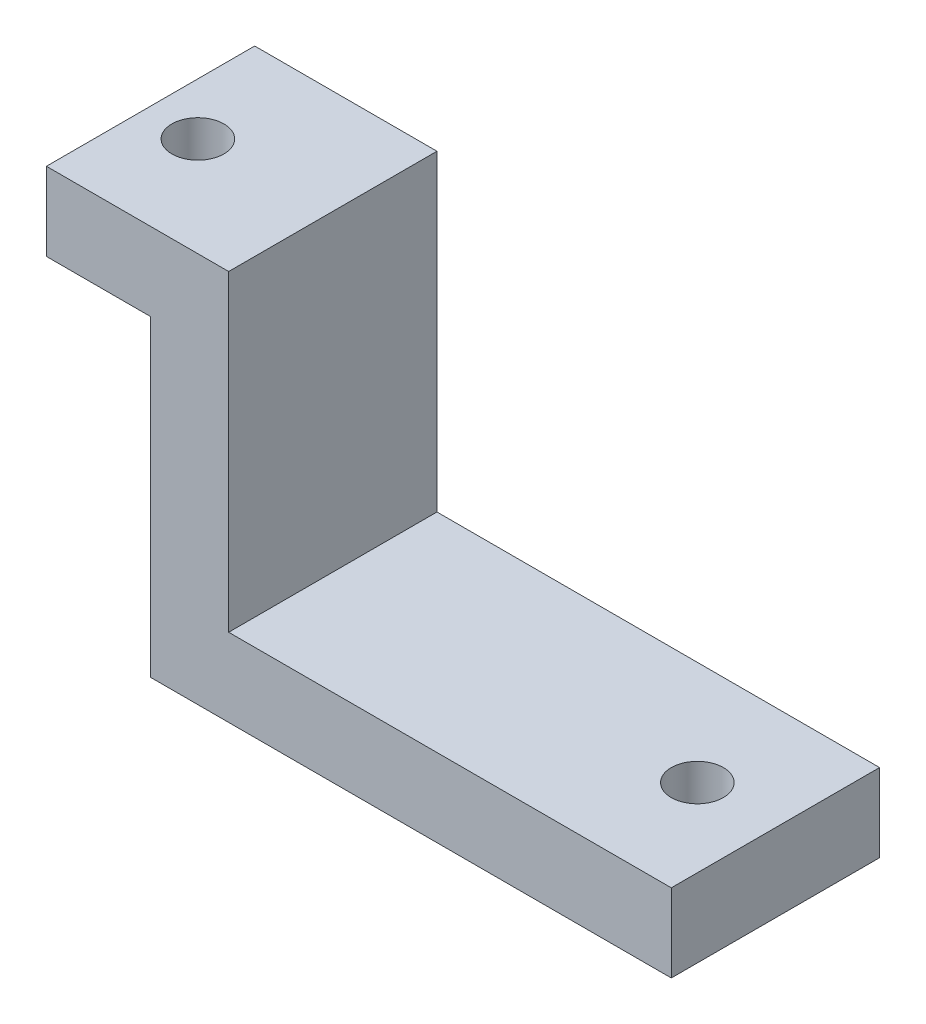
ISO-10303-21;
HEADER;
FILE_DESCRIPTION(('STEP AP214'),'2;1');
FILE_NAME('part.step','',(''),(''),'','','');
FILE_SCHEMA(('AUTOMOTIVE_DESIGN { 1 0 10303 214 1 1 1 1 }'));
ENDSEC;
DATA;
#1=APPLICATION_CONTEXT('core data for automotive mechanical design processes');
#2=APPLICATION_PROTOCOL_DEFINITION('international standard','automotive_design',2000,#1);
#3=PRODUCT_CONTEXT('',#1,'mechanical');
#4=PRODUCT('Part','Part','',(#3));
#5=PRODUCT_RELATED_PRODUCT_CATEGORY('part','',(#4));
#6=PRODUCT_DEFINITION_FORMATION('','',#4);
#7=PRODUCT_DEFINITION_CONTEXT('part definition',#1,'design');
#8=PRODUCT_DEFINITION('design','',#6,#7);
#9=PRODUCT_DEFINITION_SHAPE('','',#8);
#10=(LENGTH_UNIT() NAMED_UNIT(*) SI_UNIT(.MILLI.,.METRE.));
#11=(NAMED_UNIT(*) PLANE_ANGLE_UNIT() SI_UNIT($,.RADIAN.));
#12=(NAMED_UNIT(*) SI_UNIT($,.STERADIAN.) SOLID_ANGLE_UNIT());
#13=UNCERTAINTY_MEASURE_WITH_UNIT(LENGTH_MEASURE(1.E-05),#10,'distance_accuracy_value','');
#14=(GEOMETRIC_REPRESENTATION_CONTEXT(3) GLOBAL_UNCERTAINTY_ASSIGNED_CONTEXT((#13)) GLOBAL_UNIT_ASSIGNED_CONTEXT((#10,
#11,#12)) REPRESENTATION_CONTEXT('',''));
#15=CARTESIAN_POINT('',(0.,0.,0.));
#16=DIRECTION('',(0.,0.,1.));
#17=DIRECTION('',(1.,0.,0.));
#18=AXIS2_PLACEMENT_3D('',#15,#16,#17);
#19=CARTESIAN_POINT('',(0.,0.,0.));
#20=DIRECTION('',(-1.,0.,0.));
#21=DIRECTION('',(0.,0.,1.));
#22=AXIS2_PLACEMENT_3D('',#19,#20,#21);
#23=PLANE('',#22);
#24=DIRECTION('',(0.,-1.,0.));
#25=VECTOR('',#24,1.);
#26=CARTESIAN_POINT('',(0.,0.,0.));
#27=LINE('',#26,#25);
#28=CARTESIAN_POINT('',(0.,12.,0.));
#29=VERTEX_POINT('',#28);
#30=CARTESIAN_POINT('',(0.,0.,0.));
#31=VERTEX_POINT('',#30);
#32=EDGE_CURVE('E153',#29,#31,#27,.T.);
#33=ORIENTED_EDGE('',*,*,#32,.F.);
#34=DIRECTION('',(0.,0.,-1.));
#35=VECTOR('',#34,1.);
#36=CARTESIAN_POINT('',(0.,12.,-8.));
#37=LINE('',#36,#35);
#38=CARTESIAN_POINT('',(0.,12.,-8.));
#39=VERTEX_POINT('',#38);
#40=EDGE_CURVE('E121',#29,#39,#37,.T.);
#41=ORIENTED_EDGE('',*,*,#40,.T.);
#42=DIRECTION('',(0.,1.,0.));
#43=VECTOR('',#42,1.);
#44=CARTESIAN_POINT('',(0.,0.,-8.));
#45=LINE('',#44,#43);
#46=CARTESIAN_POINT('',(0.,0.,-8.));
#47=VERTEX_POINT('',#46);
#48=EDGE_CURVE('E120',#47,#39,#45,.T.);
#49=ORIENTED_EDGE('',*,*,#48,.F.);
#50=DIRECTION('',(0.,0.,-1.));
#51=VECTOR('',#50,1.);
#52=CARTESIAN_POINT('',(0.,0.,0.));
#53=LINE('',#52,#51);
#54=EDGE_CURVE('E162',#31,#47,#53,.T.);
#55=ORIENTED_EDGE('',*,*,#54,.F.);
#56=EDGE_LOOP('',(#33,#41,#49,#55));
#57=FACE_BOUND('',#56,.T.);
#58=ADVANCED_FACE('F34',(#57),#23,.T.);
#59=CARTESIAN_POINT('',(3.,0.,0.));
#60=DIRECTION('',(-1.,0.,0.));
#61=DIRECTION('',(0.,0.,1.));
#62=AXIS2_PLACEMENT_3D('',#59,#60,#61);
#63=PLANE('',#62);
#64=DIRECTION('',(0.,0.,1.));
#65=VECTOR('',#64,1.);
#66=CARTESIAN_POINT('',(3.,3.,-8.));
#67=LINE('',#66,#65);
#68=CARTESIAN_POINT('',(3.,3.,-8.));
#69=VERTEX_POINT('',#68);
#70=CARTESIAN_POINT('',(3.,3.,0.));
#71=VERTEX_POINT('',#70);
#72=EDGE_CURVE('E57',#69,#71,#67,.T.);
#73=ORIENTED_EDGE('',*,*,#72,.F.);
#74=DIRECTION('',(0.,1.,0.));
#75=VECTOR('',#74,1.);
#76=CARTESIAN_POINT('',(3.,0.,-8.));
#77=LINE('',#76,#75);
#78=CARTESIAN_POINT('',(3.,15.,-8.));
#79=VERTEX_POINT('',#78);
#80=EDGE_CURVE('E156',#69,#79,#77,.T.);
#81=ORIENTED_EDGE('',*,*,#80,.T.);
#82=DIRECTION('',(0.,0.,1.));
#83=VECTOR('',#82,1.);
#84=CARTESIAN_POINT('',(3.,15.,0.));
#85=LINE('',#84,#83);
#86=CARTESIAN_POINT('',(3.,15.,0.));
#87=VERTEX_POINT('',#86);
#88=EDGE_CURVE('E158',#79,#87,#85,.T.);
#89=ORIENTED_EDGE('',*,*,#88,.T.);
#90=DIRECTION('',(0.,-1.,0.));
#91=VECTOR('',#90,1.);
#92=CARTESIAN_POINT('',(3.,0.,0.));
#93=LINE('',#92,#91);
#94=EDGE_CURVE('E154',#87,#71,#93,.T.);
#95=ORIENTED_EDGE('',*,*,#94,.T.);
#96=EDGE_LOOP('',(#73,#81,#89,#95));
#97=FACE_BOUND('',#96,.T.);
#98=ADVANCED_FACE('F191',(#97),#63,.F.);
#99=CARTESIAN_POINT('',(3.,0.,0.));
#100=DIRECTION('',(0.,0.,-1.));
#101=DIRECTION('',(-1.,0.,0.));
#102=AXIS2_PLACEMENT_3D('',#99,#100,#101);
#103=PLANE('',#102);
#104=DIRECTION('',(-1.,0.,0.));
#105=VECTOR('',#104,1.);
#106=CARTESIAN_POINT('',(3.,15.,0.));
#107=LINE('',#106,#105);
#108=CARTESIAN_POINT('',(-4.,15.,0.));
#109=VERTEX_POINT('',#108);
#110=EDGE_CURVE('E160',#87,#109,#107,.T.);
#111=ORIENTED_EDGE('',*,*,#110,.T.);
#112=DIRECTION('',(0.,1.,0.));
#113=VECTOR('',#112,1.);
#114=CARTESIAN_POINT('',(-4.,12.,0.));
#115=LINE('',#114,#113);
#116=CARTESIAN_POINT('',(-4.,12.,0.));
#117=VERTEX_POINT('',#116);
#118=EDGE_CURVE('E110',#117,#109,#115,.T.);
#119=ORIENTED_EDGE('',*,*,#118,.F.);
#120=DIRECTION('',(1.,0.,0.));
#121=VECTOR('',#120,1.);
#122=CARTESIAN_POINT('',(0.,12.,0.));
#123=LINE('',#122,#121);
#124=EDGE_CURVE('E111',#117,#29,#123,.T.);
#125=ORIENTED_EDGE('',*,*,#124,.T.);
#126=ORIENTED_EDGE('',*,*,#32,.T.);
#127=DIRECTION('',(-1.,0.,0.));
#128=VECTOR('',#127,1.);
#129=CARTESIAN_POINT('',(3.,0.,0.));
#130=LINE('',#129,#128);
#131=CARTESIAN_POINT('',(20.,0.,0.));
#132=VERTEX_POINT('',#131);
#133=EDGE_CURVE('E11',#132,#31,#130,.T.);
#134=ORIENTED_EDGE('',*,*,#133,.F.);
#135=DIRECTION('',(0.,-1.,0.));
#136=VECTOR('',#135,1.);
#137=CARTESIAN_POINT('',(20.,3.,0.));
#138=LINE('',#137,#136);
#139=CARTESIAN_POINT('',(20.,3.,0.));
#140=VERTEX_POINT('',#139);
#141=EDGE_CURVE('E150',#140,#132,#138,.T.);
#142=ORIENTED_EDGE('',*,*,#141,.F.);
#143=DIRECTION('',(1.,0.,0.));
#144=VECTOR('',#143,1.);
#145=CARTESIAN_POINT('',(3.,3.,0.));
#146=LINE('',#145,#144);
#147=EDGE_CURVE('E138',#71,#140,#146,.T.);
#148=ORIENTED_EDGE('',*,*,#147,.F.);
#149=ORIENTED_EDGE('',*,*,#94,.F.);
#150=EDGE_LOOP('',(#111,#119,#125,#126,#134,#142,#148,#149));
#151=FACE_BOUND('',#150,.T.);
#152=ADVANCED_FACE('F36',(#151),#103,.F.);
#153=CARTESIAN_POINT('',(3.,0.,0.));
#154=DIRECTION('',(0.,1.,0.));
#155=DIRECTION('',(0.,0.,1.));
#156=AXIS2_PLACEMENT_3D('',#153,#154,#155);
#157=PLANE('',#156);
#158=ORIENTED_EDGE('',*,*,#54,.T.);
#159=DIRECTION('',(-1.,0.,0.));
#160=VECTOR('',#159,1.);
#161=CARTESIAN_POINT('',(3.,0.,-8.));
#162=LINE('',#161,#160);
#163=CARTESIAN_POINT('',(20.,0.,-8.));
#164=VERTEX_POINT('',#163);
#165=EDGE_CURVE('E42',#164,#47,#162,.T.);
#166=ORIENTED_EDGE('',*,*,#165,.F.);
#167=DIRECTION('',(0.,0.,-1.));
#168=VECTOR('',#167,1.);
#169=CARTESIAN_POINT('',(20.,0.,-8.));
#170=LINE('',#169,#168);
#171=EDGE_CURVE('E134',#132,#164,#170,.T.);
#172=ORIENTED_EDGE('',*,*,#171,.F.);
#173=ORIENTED_EDGE('',*,*,#133,.T.);
#174=EDGE_LOOP('',(#158,#166,#172,#173));
#175=FACE_BOUND('',#174,.T.);
#176=CARTESIAN_POINT('',(17.,0.,-4.));
#177=DIRECTION('',(0.,1.,0.));
#178=DIRECTION('',(0.,0.,1.));
#179=AXIS2_PLACEMENT_3D('',#176,#177,#178);
#180=CIRCLE('',#179,1.);
#181=CARTESIAN_POINT('',(17.,0.,-3.));
#182=VERTEX_POINT('',#181);
#183=EDGE_CURVE('E129',#182,#182,#180,.T.);
#184=ORIENTED_EDGE('',*,*,#183,.T.);
#185=EDGE_LOOP('',(#184));
#186=FACE_BOUND('',#185,.T.);
#187=ADVANCED_FACE('F189',(#175,#186),#157,.F.);
#188=CARTESIAN_POINT('',(3.,0.,-8.));
#189=DIRECTION('',(0.,0.,1.));
#190=DIRECTION('',(1.,0.,0.));
#191=AXIS2_PLACEMENT_3D('',#188,#189,#190);
#192=PLANE('',#191);
#193=ORIENTED_EDGE('',*,*,#48,.T.);
#194=DIRECTION('',(-1.,0.,0.));
#195=VECTOR('',#194,1.);
#196=CARTESIAN_POINT('',(0.,12.,-8.));
#197=LINE('',#196,#195);
#198=CARTESIAN_POINT('',(-4.,12.,-8.));
#199=VERTEX_POINT('',#198);
#200=EDGE_CURVE('E49',#39,#199,#197,.T.);
#201=ORIENTED_EDGE('',*,*,#200,.T.);
#202=DIRECTION('',(0.,1.,0.));
#203=VECTOR('',#202,1.);
#204=CARTESIAN_POINT('',(-4.,12.,-8.));
#205=LINE('',#204,#203);
#206=CARTESIAN_POINT('',(-4.,15.,-8.));
#207=VERTEX_POINT('',#206);
#208=EDGE_CURVE('E101',#199,#207,#205,.T.);
#209=ORIENTED_EDGE('',*,*,#208,.T.);
#210=DIRECTION('',(-1.,0.,0.));
#211=VECTOR('',#210,1.);
#212=CARTESIAN_POINT('',(3.,15.,-8.));
#213=LINE('',#212,#211);
#214=EDGE_CURVE('E166',#79,#207,#213,.T.);
#215=ORIENTED_EDGE('',*,*,#214,.F.);
#216=ORIENTED_EDGE('',*,*,#80,.F.);
#217=DIRECTION('',(-1.,0.,0.));
#218=VECTOR('',#217,1.);
#219=CARTESIAN_POINT('',(3.,3.,-8.));
#220=LINE('',#219,#218);
#221=CARTESIAN_POINT('',(20.,3.,-8.));
#222=VERTEX_POINT('',#221);
#223=EDGE_CURVE('E142',#222,#69,#220,.T.);
#224=ORIENTED_EDGE('',*,*,#223,.F.);
#225=DIRECTION('',(0.,-1.,0.));
#226=VECTOR('',#225,1.);
#227=CARTESIAN_POINT('',(20.,3.,-8.));
#228=LINE('',#227,#226);
#229=EDGE_CURVE('E145',#222,#164,#228,.T.);
#230=ORIENTED_EDGE('',*,*,#229,.T.);
#231=ORIENTED_EDGE('',*,*,#165,.T.);
#232=EDGE_LOOP('',(#193,#201,#209,#215,#216,#224,#230,#231));
#233=FACE_BOUND('',#232,.T.);
#234=ADVANCED_FACE('F117',(#233),#192,.F.);
#235=CARTESIAN_POINT('',(3.,15.,0.));
#236=DIRECTION('',(0.,-1.,0.));
#237=DIRECTION('',(0.,0.,-1.));
#238=AXIS2_PLACEMENT_3D('',#235,#236,#237);
#239=PLANE('',#238);
#240=ORIENTED_EDGE('',*,*,#214,.T.);
#241=DIRECTION('',(0.,0.,1.));
#242=VECTOR('',#241,1.);
#243=CARTESIAN_POINT('',(-4.,15.,-8.));
#244=LINE('',#243,#242);
#245=EDGE_CURVE('E107',#207,#109,#244,.T.);
#246=ORIENTED_EDGE('',*,*,#245,.T.);
#247=ORIENTED_EDGE('',*,*,#110,.F.);
#248=ORIENTED_EDGE('',*,*,#88,.F.);
#249=EDGE_LOOP('',(#240,#246,#247,#248));
#250=FACE_BOUND('',#249,.T.);
#251=CARTESIAN_POINT('',(-2.,15.,-3.81772143015269));
#252=DIRECTION('',(0.,1.,0.));
#253=DIRECTION('',(0.,0.,1.));
#254=AXIS2_PLACEMENT_3D('',#251,#252,#253);
#255=CIRCLE('',#254,1.);
#256=CARTESIAN_POINT('',(-2.,15.,-2.81772143015269));
#257=VERTEX_POINT('',#256);
#258=EDGE_CURVE('E314',#257,#257,#255,.T.);
#259=ORIENTED_EDGE('',*,*,#258,.F.);
#260=EDGE_LOOP('',(#259));
#261=FACE_BOUND('',#260,.T.);
#262=ADVANCED_FACE('F178',(#250,#261),#239,.F.);
#263=CARTESIAN_POINT('',(0.,3.,0.));
#264=DIRECTION('',(0.,1.,0.));
#265=DIRECTION('',(0.,0.,1.));
#266=AXIS2_PLACEMENT_3D('',#263,#264,#265);
#267=PLANE('',#266);
#268=ORIENTED_EDGE('',*,*,#72,.T.);
#269=ORIENTED_EDGE('',*,*,#147,.T.);
#270=DIRECTION('',(0.,0.,-1.));
#271=VECTOR('',#270,1.);
#272=CARTESIAN_POINT('',(20.,3.,-8.));
#273=LINE('',#272,#271);
#274=EDGE_CURVE('E140',#140,#222,#273,.T.);
#275=ORIENTED_EDGE('',*,*,#274,.T.);
#276=ORIENTED_EDGE('',*,*,#223,.T.);
#277=EDGE_LOOP('',(#268,#269,#275,#276));
#278=FACE_BOUND('',#277,.T.);
#279=CARTESIAN_POINT('',(17.,3.,-4.));
#280=DIRECTION('',(0.,1.,0.));
#281=DIRECTION('',(0.,0.,1.));
#282=AXIS2_PLACEMENT_3D('',#279,#280,#281);
#283=CIRCLE('',#282,1.);
#284=CARTESIAN_POINT('',(17.,3.,-3.));
#285=VERTEX_POINT('',#284);
#286=EDGE_CURVE('E131',#285,#285,#283,.T.);
#287=ORIENTED_EDGE('',*,*,#286,.F.);
#288=EDGE_LOOP('',(#287));
#289=FACE_BOUND('',#288,.T.);
#290=ADVANCED_FACE('F182',(#278,#289),#267,.T.);
#291=CARTESIAN_POINT('',(20.,3.,-8.));
#292=DIRECTION('',(-1.,0.,0.));
#293=DIRECTION('',(0.,0.,1.));
#294=AXIS2_PLACEMENT_3D('',#291,#292,#293);
#295=PLANE('',#294);
#296=ORIENTED_EDGE('',*,*,#171,.T.);
#297=ORIENTED_EDGE('',*,*,#229,.F.);
#298=ORIENTED_EDGE('',*,*,#274,.F.);
#299=ORIENTED_EDGE('',*,*,#141,.T.);
#300=EDGE_LOOP('',(#296,#297,#298,#299));
#301=FACE_BOUND('',#300,.T.);
#302=ADVANCED_FACE('F188',(#301),#295,.F.);
#303=CARTESIAN_POINT('',(17.,3.,-4.));
#304=DIRECTION('',(0.,-1.,0.));
#305=DIRECTION('',(0.,0.,-1.));
#306=AXIS2_PLACEMENT_3D('',#303,#304,#305);
#307=CYLINDRICAL_SURFACE('',#306,1.);
#308=ORIENTED_EDGE('',*,*,#286,.T.);
#309=EDGE_LOOP('',(#308));
#310=FACE_BOUND('',#309,.T.);
#311=ORIENTED_EDGE('',*,*,#183,.F.);
#312=EDGE_LOOP('',(#311));
#313=FACE_BOUND('',#312,.T.);
#314=ADVANCED_FACE('F230',(#310,#313),#307,.F.);
#315=CARTESIAN_POINT('',(-4.,12.,-8.));
#316=DIRECTION('',(-1.,0.,0.));
#317=DIRECTION('',(0.,0.,1.));
#318=AXIS2_PLACEMENT_3D('',#315,#316,#317);
#319=PLANE('',#318);
#320=ORIENTED_EDGE('',*,*,#245,.F.);
#321=ORIENTED_EDGE('',*,*,#208,.F.);
#322=DIRECTION('',(0.,0.,1.));
#323=VECTOR('',#322,1.);
#324=CARTESIAN_POINT('',(-4.,12.,-8.));
#325=LINE('',#324,#323);
#326=EDGE_CURVE('E104',#199,#117,#325,.T.);
#327=ORIENTED_EDGE('',*,*,#326,.T.);
#328=ORIENTED_EDGE('',*,*,#118,.T.);
#329=EDGE_LOOP('',(#320,#321,#327,#328));
#330=FACE_BOUND('',#329,.T.);
#331=ADVANCED_FACE('F102',(#330),#319,.T.);
#332=CARTESIAN_POINT('',(0.,12.,0.));
#333=DIRECTION('',(0.,-1.,0.));
#334=DIRECTION('',(0.,0.,-1.));
#335=AXIS2_PLACEMENT_3D('',#332,#333,#334);
#336=PLANE('',#335);
#337=CARTESIAN_POINT('',(-2.,12.,-3.81772143015269));
#338=DIRECTION('',(0.,1.,0.));
#339=DIRECTION('',(0.,0.,1.));
#340=AXIS2_PLACEMENT_3D('',#337,#338,#339);
#341=CIRCLE('',#340,1.);
#342=CARTESIAN_POINT('',(-2.,12.,-2.81772143015269));
#343=VERTEX_POINT('',#342);
#344=EDGE_CURVE('E128',#343,#343,#341,.T.);
#345=ORIENTED_EDGE('',*,*,#344,.T.);
#346=EDGE_LOOP('',(#345));
#347=FACE_BOUND('',#346,.T.);
#348=ORIENTED_EDGE('',*,*,#40,.F.);
#349=ORIENTED_EDGE('',*,*,#124,.F.);
#350=ORIENTED_EDGE('',*,*,#326,.F.);
#351=ORIENTED_EDGE('',*,*,#200,.F.);
#352=EDGE_LOOP('',(#348,#349,#350,#351));
#353=FACE_BOUND('',#352,.T.);
#354=ADVANCED_FACE('F113',(#347,#353),#336,.T.);
#355=CARTESIAN_POINT('',(-2.,12.,-3.81772143015269));
#356=DIRECTION('',(0.,1.,0.));
#357=DIRECTION('',(0.,0.,1.));
#358=AXIS2_PLACEMENT_3D('',#355,#356,#357);
#359=CYLINDRICAL_SURFACE('',#358,1.);
#360=ORIENTED_EDGE('',*,*,#344,.F.);
#361=EDGE_LOOP('',(#360));
#362=FACE_BOUND('',#361,.T.);
#363=ORIENTED_EDGE('',*,*,#258,.T.);
#364=EDGE_LOOP('',(#363));
#365=FACE_BOUND('',#364,.T.);
#366=ADVANCED_FACE('F249',(#362,#365),#359,.F.);
#367=CLOSED_SHELL('',(#58,#98,#152,#187,#234,#262,#290,#302,#314,#331,#354,#366));
#368=MANIFOLD_SOLID_BREP('B2',#367);
#369=ADVANCED_BREP_SHAPE_REPRESENTATION('',(#18,#368),#14);
#370=SHAPE_DEFINITION_REPRESENTATION(#9,#369);
ENDSEC;
END-ISO-10303-21;
